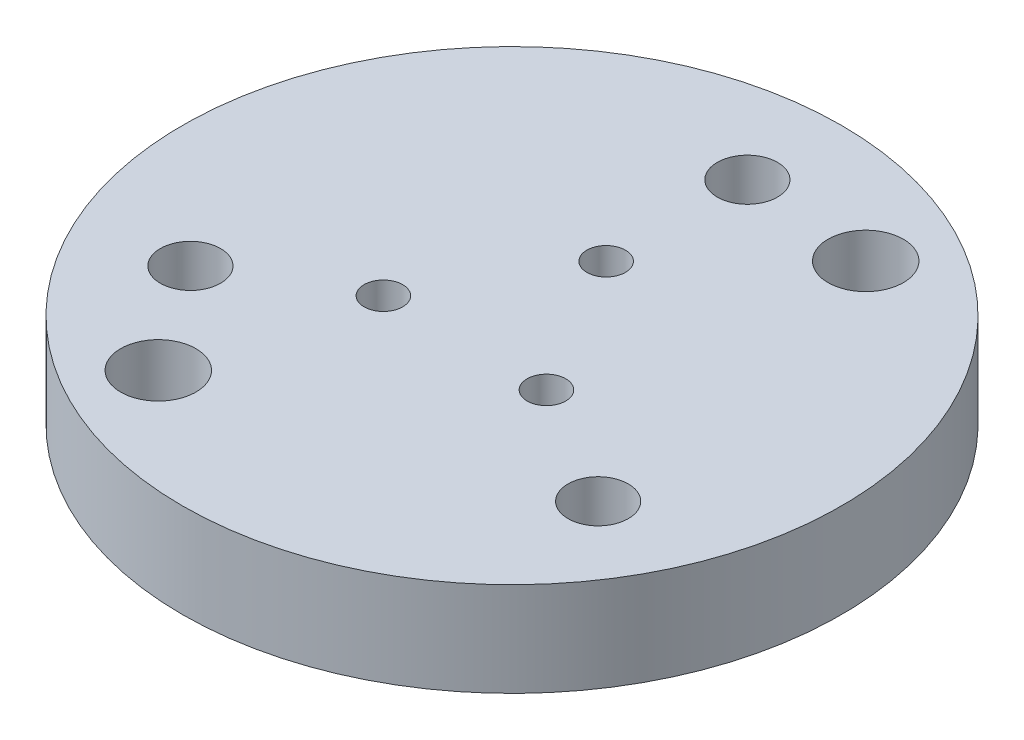
ISO-10303-21;
HEADER;
FILE_DESCRIPTION(('STEP AP214'),'2;1');
FILE_NAME('part.step','',(''),(''),'','','');
FILE_SCHEMA(('AUTOMOTIVE_DESIGN { 1 0 10303 214 1 1 1 1 }'));
ENDSEC;
DATA;
#1=APPLICATION_CONTEXT('core data for automotive mechanical design processes');
#2=APPLICATION_PROTOCOL_DEFINITION('international standard','automotive_design',2000,#1);
#3=PRODUCT_CONTEXT('',#1,'mechanical');
#4=PRODUCT('Part','Part','',(#3));
#5=PRODUCT_RELATED_PRODUCT_CATEGORY('part','',(#4));
#6=PRODUCT_DEFINITION_FORMATION('','',#4);
#7=PRODUCT_DEFINITION_CONTEXT('part definition',#1,'design');
#8=PRODUCT_DEFINITION('design','',#6,#7);
#9=PRODUCT_DEFINITION_SHAPE('','',#8);
#10=(LENGTH_UNIT() NAMED_UNIT(*) SI_UNIT(.MILLI.,.METRE.));
#11=(NAMED_UNIT(*) PLANE_ANGLE_UNIT() SI_UNIT($,.RADIAN.));
#12=(NAMED_UNIT(*) SI_UNIT($,.STERADIAN.) SOLID_ANGLE_UNIT());
#13=UNCERTAINTY_MEASURE_WITH_UNIT(LENGTH_MEASURE(1.E-05),#10,'distance_accuracy_value','');
#14=(GEOMETRIC_REPRESENTATION_CONTEXT(3) GLOBAL_UNCERTAINTY_ASSIGNED_CONTEXT((#13)) GLOBAL_UNIT_ASSIGNED_CONTEXT((#10,
#11,#12)) REPRESENTATION_CONTEXT('',''));
#15=CARTESIAN_POINT('',(0.,0.,0.));
#16=DIRECTION('',(0.,0.,1.));
#17=DIRECTION('',(1.,0.,0.));
#18=AXIS2_PLACEMENT_3D('',#15,#16,#17);
#19=CARTESIAN_POINT('',(0.,-10.,0.));
#20=DIRECTION('',(0.,1.,0.));
#21=DIRECTION('',(0.,0.,1.));
#22=AXIS2_PLACEMENT_3D('',#19,#20,#21);
#23=CYLINDRICAL_SURFACE('',#22,35.);
#24=CARTESIAN_POINT('',(0.,-10.,0.));
#25=DIRECTION('',(0.,1.,0.));
#26=DIRECTION('',(0.,0.,1.));
#27=AXIS2_PLACEMENT_3D('',#24,#25,#26);
#28=CIRCLE('',#27,35.);
#29=CARTESIAN_POINT('',(0.,-10.,35.));
#30=VERTEX_POINT('',#29);
#31=EDGE_CURVE('E10',#30,#30,#28,.T.);
#32=ORIENTED_EDGE('',*,*,#31,.T.);
#33=EDGE_LOOP('',(#32));
#34=FACE_BOUND('',#33,.T.);
#35=CARTESIAN_POINT('',(0.,0.,0.));
#36=DIRECTION('',(0.,1.,0.));
#37=DIRECTION('',(0.,0.,1.));
#38=AXIS2_PLACEMENT_3D('',#35,#36,#37);
#39=CIRCLE('',#38,35.);
#40=CARTESIAN_POINT('',(0.,0.,35.));
#41=VERTEX_POINT('',#40);
#42=EDGE_CURVE('E40',#41,#41,#39,.T.);
#43=ORIENTED_EDGE('',*,*,#42,.F.);
#44=EDGE_LOOP('',(#43));
#45=FACE_BOUND('',#44,.T.);
#46=ADVANCED_FACE('F37',(#34,#45),#23,.T.);
#47=CARTESIAN_POINT('',(0.,-10.,0.));
#48=DIRECTION('',(0.,1.,0.));
#49=DIRECTION('',(0.,0.,1.));
#50=AXIS2_PLACEMENT_3D('',#47,#48,#49);
#51=PLANE('',#50);
#52=CARTESIAN_POINT('',(21.650635094611,-10.,12.5));
#53=DIRECTION('',(0.,-1.,0.));
#54=DIRECTION('',(0.,0.,-1.));
#55=AXIS2_PLACEMENT_3D('',#52,#53,#54);
#56=CIRCLE('',#55,3.2);
#57=CARTESIAN_POINT('',(21.650635094611,-10.,9.29999999999996));
#58=VERTEX_POINT('',#57);
#59=EDGE_CURVE('E93',#58,#58,#56,.T.);
#60=ORIENTED_EDGE('',*,*,#59,.F.);
#61=EDGE_LOOP('',(#60));
#62=FACE_BOUND('',#61,.T.);
#63=CARTESIAN_POINT('',(-21.650635094611,-10.,12.4999999999999));
#64=DIRECTION('',(0.,-1.,0.));
#65=DIRECTION('',(0.,0.,-1.));
#66=AXIS2_PLACEMENT_3D('',#63,#64,#65);
#67=CIRCLE('',#66,3.2);
#68=CARTESIAN_POINT('',(-21.650635094611,-10.,9.29999999999995));
#69=VERTEX_POINT('',#68);
#70=EDGE_CURVE('E87',#69,#69,#67,.T.);
#71=ORIENTED_EDGE('',*,*,#70,.F.);
#72=EDGE_LOOP('',(#71));
#73=FACE_BOUND('',#72,.T.);
#74=CARTESIAN_POINT('',(0.,-10.,-25.));
#75=DIRECTION('',(0.,-1.,0.));
#76=DIRECTION('',(0.,0.,-1.));
#77=AXIS2_PLACEMENT_3D('',#74,#75,#76);
#78=CIRCLE('',#77,3.2);
#79=CARTESIAN_POINT('',(0.,-10.,-28.2));
#80=VERTEX_POINT('',#79);
#81=EDGE_CURVE('E81',#80,#80,#78,.T.);
#82=ORIENTED_EDGE('',*,*,#81,.F.);
#83=EDGE_LOOP('',(#82));
#84=FACE_BOUND('',#83,.T.);
#85=CARTESIAN_POINT('',(13.75,-10.,-23.815698604072));
#86=DIRECTION('',(0.,-1.,0.));
#87=DIRECTION('',(0.,0.,-1.));
#88=AXIS2_PLACEMENT_3D('',#85,#86,#87);
#89=CIRCLE('',#88,3.99999999999999);
#90=CARTESIAN_POINT('',(13.75,-10.,-27.815698604072));
#91=VERTEX_POINT('',#90);
#92=EDGE_CURVE('E75',#91,#91,#89,.T.);
#93=ORIENTED_EDGE('',*,*,#92,.F.);
#94=EDGE_LOOP('',(#93));
#95=FACE_BOUND('',#94,.T.);
#96=CARTESIAN_POINT('',(-13.75,-10.,23.815698604072));
#97=DIRECTION('',(0.,-1.,0.));
#98=DIRECTION('',(0.,0.,-1.));
#99=AXIS2_PLACEMENT_3D('',#96,#97,#98);
#100=CIRCLE('',#99,3.99999999999999);
#101=CARTESIAN_POINT('',(-13.75,-10.,19.8156986040721));
#102=VERTEX_POINT('',#101);
#103=EDGE_CURVE('E69',#102,#102,#100,.T.);
#104=ORIENTED_EDGE('',*,*,#103,.F.);
#105=EDGE_LOOP('',(#104));
#106=FACE_BOUND('',#105,.T.);
#107=CARTESIAN_POINT('',(8.66025403784439,-10.,4.99999999999998));
#108=DIRECTION('',(0.,1.,0.));
#109=DIRECTION('',(0.,0.,1.));
#110=AXIS2_PLACEMENT_3D('',#107,#108,#109);
#111=CIRCLE('',#110,2.05);
#112=CARTESIAN_POINT('',(8.66025403784439,-10.,7.04999999999997));
#113=VERTEX_POINT('',#112);
#114=EDGE_CURVE('E47',#113,#113,#111,.F.);
#115=ORIENTED_EDGE('',*,*,#114,.F.);
#116=EDGE_LOOP('',(#115));
#117=FACE_BOUND('',#116,.T.);
#118=CARTESIAN_POINT('',(0.,-10.,-10.));
#119=DIRECTION('',(0.,1.,0.));
#120=DIRECTION('',(0.,0.,1.));
#121=AXIS2_PLACEMENT_3D('',#118,#119,#120);
#122=CIRCLE('',#121,2.05);
#123=CARTESIAN_POINT('',(0.,-10.,-7.95));
#124=VERTEX_POINT('',#123);
#125=EDGE_CURVE('E52',#124,#124,#122,.F.);
#126=ORIENTED_EDGE('',*,*,#125,.F.);
#127=EDGE_LOOP('',(#126));
#128=FACE_BOUND('',#127,.T.);
#129=CARTESIAN_POINT('',(-8.6602540378444,-10.,4.99999999999998));
#130=DIRECTION('',(0.,1.,0.));
#131=DIRECTION('',(0.,0.,1.));
#132=AXIS2_PLACEMENT_3D('',#129,#130,#131);
#133=CIRCLE('',#132,2.05);
#134=CARTESIAN_POINT('',(-8.6602540378444,-10.,7.04999999999998));
#135=VERTEX_POINT('',#134);
#136=EDGE_CURVE('E53',#135,#135,#133,.F.);
#137=ORIENTED_EDGE('',*,*,#136,.F.);
#138=EDGE_LOOP('',(#137));
#139=FACE_BOUND('',#138,.T.);
#140=ORIENTED_EDGE('',*,*,#31,.F.);
#141=EDGE_LOOP('',(#140));
#142=FACE_BOUND('',#141,.T.);
#143=ADVANCED_FACE('F99',(#62,#73,#84,#95,#106,#117,#128,#139,#142),#51,.F.);
#144=CARTESIAN_POINT('',(0.,0.,0.));
#145=DIRECTION('',(0.,1.,0.));
#146=DIRECTION('',(0.,0.,1.));
#147=AXIS2_PLACEMENT_3D('',#144,#145,#146);
#148=PLANE('',#147);
#149=CARTESIAN_POINT('',(21.650635094611,0.,12.5));
#150=DIRECTION('',(0.,-1.,0.));
#151=DIRECTION('',(0.,0.,-1.));
#152=AXIS2_PLACEMENT_3D('',#149,#150,#151);
#153=CIRCLE('',#152,3.2);
#154=CARTESIAN_POINT('',(21.650635094611,0.,9.29999999999996));
#155=VERTEX_POINT('',#154);
#156=EDGE_CURVE('E90',#155,#155,#153,.T.);
#157=ORIENTED_EDGE('',*,*,#156,.T.);
#158=EDGE_LOOP('',(#157));
#159=FACE_BOUND('',#158,.T.);
#160=CARTESIAN_POINT('',(-21.650635094611,0.,12.4999999999999));
#161=DIRECTION('',(0.,-1.,0.));
#162=DIRECTION('',(0.,0.,-1.));
#163=AXIS2_PLACEMENT_3D('',#160,#161,#162);
#164=CIRCLE('',#163,3.2);
#165=CARTESIAN_POINT('',(-21.650635094611,0.,9.29999999999995));
#166=VERTEX_POINT('',#165);
#167=EDGE_CURVE('E84',#166,#166,#164,.T.);
#168=ORIENTED_EDGE('',*,*,#167,.T.);
#169=EDGE_LOOP('',(#168));
#170=FACE_BOUND('',#169,.T.);
#171=CARTESIAN_POINT('',(0.,0.,-25.));
#172=DIRECTION('',(0.,-1.,0.));
#173=DIRECTION('',(0.,0.,-1.));
#174=AXIS2_PLACEMENT_3D('',#171,#172,#173);
#175=CIRCLE('',#174,3.2);
#176=CARTESIAN_POINT('',(0.,0.,-28.2));
#177=VERTEX_POINT('',#176);
#178=EDGE_CURVE('E78',#177,#177,#175,.T.);
#179=ORIENTED_EDGE('',*,*,#178,.T.);
#180=EDGE_LOOP('',(#179));
#181=FACE_BOUND('',#180,.T.);
#182=CARTESIAN_POINT('',(13.75,0.,-23.815698604072));
#183=DIRECTION('',(0.,-1.,0.));
#184=DIRECTION('',(0.,0.,-1.));
#185=AXIS2_PLACEMENT_3D('',#182,#183,#184);
#186=CIRCLE('',#185,4.);
#187=CARTESIAN_POINT('',(13.75,0.,-27.815698604072));
#188=VERTEX_POINT('',#187);
#189=EDGE_CURVE('E72',#188,#188,#186,.T.);
#190=ORIENTED_EDGE('',*,*,#189,.T.);
#191=EDGE_LOOP('',(#190));
#192=FACE_BOUND('',#191,.T.);
#193=CARTESIAN_POINT('',(-13.75,0.,23.815698604072));
#194=DIRECTION('',(0.,-1.,0.));
#195=DIRECTION('',(0.,0.,-1.));
#196=AXIS2_PLACEMENT_3D('',#193,#194,#195);
#197=CIRCLE('',#196,4.);
#198=CARTESIAN_POINT('',(-13.75,0.,19.8156986040721));
#199=VERTEX_POINT('',#198);
#200=EDGE_CURVE('E56',#199,#199,#197,.T.);
#201=ORIENTED_EDGE('',*,*,#200,.T.);
#202=EDGE_LOOP('',(#201));
#203=FACE_BOUND('',#202,.T.);
#204=CARTESIAN_POINT('',(8.66025403784439,0.,4.99999999999998));
#205=DIRECTION('',(0.,1.,0.));
#206=DIRECTION('',(0.,0.,1.));
#207=AXIS2_PLACEMENT_3D('',#204,#205,#206);
#208=CIRCLE('',#207,2.05);
#209=CARTESIAN_POINT('',(8.66025403784439,0.,7.04999999999997));
#210=VERTEX_POINT('',#209);
#211=EDGE_CURVE('E60',#210,#210,#208,.T.);
#212=ORIENTED_EDGE('',*,*,#211,.F.);
#213=EDGE_LOOP('',(#212));
#214=FACE_BOUND('',#213,.T.);
#215=CARTESIAN_POINT('',(0.,0.,-10.));
#216=DIRECTION('',(0.,1.,0.));
#217=DIRECTION('',(0.,0.,1.));
#218=AXIS2_PLACEMENT_3D('',#215,#216,#217);
#219=CIRCLE('',#218,2.05);
#220=CARTESIAN_POINT('',(0.,0.,-7.95));
#221=VERTEX_POINT('',#220);
#222=EDGE_CURVE('E57',#221,#221,#219,.T.);
#223=ORIENTED_EDGE('',*,*,#222,.F.);
#224=EDGE_LOOP('',(#223));
#225=FACE_BOUND('',#224,.T.);
#226=CARTESIAN_POINT('',(-8.6602540378444,0.,4.99999999999998));
#227=DIRECTION('',(0.,1.,0.));
#228=DIRECTION('',(0.,0.,1.));
#229=AXIS2_PLACEMENT_3D('',#226,#227,#228);
#230=CIRCLE('',#229,2.05);
#231=CARTESIAN_POINT('',(-8.6602540378444,0.,7.04999999999998));
#232=VERTEX_POINT('',#231);
#233=EDGE_CURVE('E49',#232,#232,#230,.T.);
#234=ORIENTED_EDGE('',*,*,#233,.F.);
#235=EDGE_LOOP('',(#234));
#236=FACE_BOUND('',#235,.T.);
#237=ORIENTED_EDGE('',*,*,#42,.T.);
#238=EDGE_LOOP('',(#237));
#239=FACE_BOUND('',#238,.T.);
#240=ADVANCED_FACE('F102',(#159,#170,#181,#192,#203,#214,#225,#236,#239),#148,.T.);
#241=CARTESIAN_POINT('',(-8.6602540378444,-10.001,4.99999999999998));
#242=DIRECTION('',(0.,1.,0.));
#243=DIRECTION('',(0.,0.,1.));
#244=AXIS2_PLACEMENT_3D('',#241,#242,#243);
#245=CYLINDRICAL_SURFACE('',#244,2.05);
#246=ORIENTED_EDGE('',*,*,#233,.T.);
#247=EDGE_LOOP('',(#246));
#248=FACE_BOUND('',#247,.T.);
#249=ORIENTED_EDGE('',*,*,#136,.T.);
#250=EDGE_LOOP('',(#249));
#251=FACE_BOUND('',#250,.T.);
#252=ADVANCED_FACE('F119',(#248,#251),#245,.F.);
#253=CARTESIAN_POINT('',(0.,-10.001,-10.));
#254=DIRECTION('',(0.,1.,0.));
#255=DIRECTION('',(0.,0.,1.));
#256=AXIS2_PLACEMENT_3D('',#253,#254,#255);
#257=CYLINDRICAL_SURFACE('',#256,2.05);
#258=ORIENTED_EDGE('',*,*,#222,.T.);
#259=EDGE_LOOP('',(#258));
#260=FACE_BOUND('',#259,.T.);
#261=ORIENTED_EDGE('',*,*,#125,.T.);
#262=EDGE_LOOP('',(#261));
#263=FACE_BOUND('',#262,.T.);
#264=ADVANCED_FACE('F121',(#260,#263),#257,.F.);
#265=CARTESIAN_POINT('',(8.66025403784439,-10.001,4.99999999999998));
#266=DIRECTION('',(0.,1.,0.));
#267=DIRECTION('',(0.,0.,1.));
#268=AXIS2_PLACEMENT_3D('',#265,#266,#267);
#269=CYLINDRICAL_SURFACE('',#268,2.05);
#270=ORIENTED_EDGE('',*,*,#211,.T.);
#271=EDGE_LOOP('',(#270));
#272=FACE_BOUND('',#271,.T.);
#273=ORIENTED_EDGE('',*,*,#114,.T.);
#274=EDGE_LOOP('',(#273));
#275=FACE_BOUND('',#274,.T.);
#276=ADVANCED_FACE('F128',(#272,#275),#269,.F.);
#277=CARTESIAN_POINT('',(-13.75,-10.,23.815698604072));
#278=DIRECTION('',(0.,-1.,0.));
#279=DIRECTION('',(0.,0.,-1.));
#280=AXIS2_PLACEMENT_3D('',#277,#278,#279);
#281=CYLINDRICAL_SURFACE('',#280,3.99999999999999);
#282=ORIENTED_EDGE('',*,*,#200,.F.);
#283=EDGE_LOOP('',(#282));
#284=FACE_BOUND('',#283,.T.);
#285=ORIENTED_EDGE('',*,*,#103,.T.);
#286=EDGE_LOOP('',(#285));
#287=FACE_BOUND('',#286,.T.);
#288=ADVANCED_FACE('F172',(#284,#287),#281,.F.);
#289=CARTESIAN_POINT('',(13.75,-10.,-23.815698604072));
#290=DIRECTION('',(0.,-1.,0.));
#291=DIRECTION('',(0.,0.,-1.));
#292=AXIS2_PLACEMENT_3D('',#289,#290,#291);
#293=CYLINDRICAL_SURFACE('',#292,3.99999999999999);
#294=ORIENTED_EDGE('',*,*,#189,.F.);
#295=EDGE_LOOP('',(#294));
#296=FACE_BOUND('',#295,.T.);
#297=ORIENTED_EDGE('',*,*,#92,.T.);
#298=EDGE_LOOP('',(#297));
#299=FACE_BOUND('',#298,.T.);
#300=ADVANCED_FACE('F182',(#296,#299),#293,.F.);
#301=CARTESIAN_POINT('',(0.,-10.,-25.));
#302=DIRECTION('',(0.,-1.,0.));
#303=DIRECTION('',(0.,0.,-1.));
#304=AXIS2_PLACEMENT_3D('',#301,#302,#303);
#305=CYLINDRICAL_SURFACE('',#304,3.2);
#306=ORIENTED_EDGE('',*,*,#178,.F.);
#307=EDGE_LOOP('',(#306));
#308=FACE_BOUND('',#307,.T.);
#309=ORIENTED_EDGE('',*,*,#81,.T.);
#310=EDGE_LOOP('',(#309));
#311=FACE_BOUND('',#310,.T.);
#312=ADVANCED_FACE('F191',(#308,#311),#305,.F.);
#313=CARTESIAN_POINT('',(-21.650635094611,-10.,12.4999999999999));
#314=DIRECTION('',(0.,-1.,0.));
#315=DIRECTION('',(0.,0.,-1.));
#316=AXIS2_PLACEMENT_3D('',#313,#314,#315);
#317=CYLINDRICAL_SURFACE('',#316,3.2);
#318=ORIENTED_EDGE('',*,*,#167,.F.);
#319=EDGE_LOOP('',(#318));
#320=FACE_BOUND('',#319,.T.);
#321=ORIENTED_EDGE('',*,*,#70,.T.);
#322=EDGE_LOOP('',(#321));
#323=FACE_BOUND('',#322,.T.);
#324=ADVANCED_FACE('F200',(#320,#323),#317,.F.);
#325=CARTESIAN_POINT('',(21.650635094611,-10.,12.5));
#326=DIRECTION('',(0.,-1.,0.));
#327=DIRECTION('',(0.,0.,-1.));
#328=AXIS2_PLACEMENT_3D('',#325,#326,#327);
#329=CYLINDRICAL_SURFACE('',#328,3.2);
#330=ORIENTED_EDGE('',*,*,#156,.F.);
#331=EDGE_LOOP('',(#330));
#332=FACE_BOUND('',#331,.T.);
#333=ORIENTED_EDGE('',*,*,#59,.T.);
#334=EDGE_LOOP('',(#333));
#335=FACE_BOUND('',#334,.T.);
#336=ADVANCED_FACE('F97',(#332,#335),#329,.F.);
#337=CLOSED_SHELL('',(#46,#143,#240,#252,#264,#276,#288,#300,#312,#324,#336));
#338=MANIFOLD_SOLID_BREP('B2',#337);
#339=ADVANCED_BREP_SHAPE_REPRESENTATION('',(#18,#338),#14);
#340=SHAPE_DEFINITION_REPRESENTATION(#9,#339);
ENDSEC;
END-ISO-10303-21;
